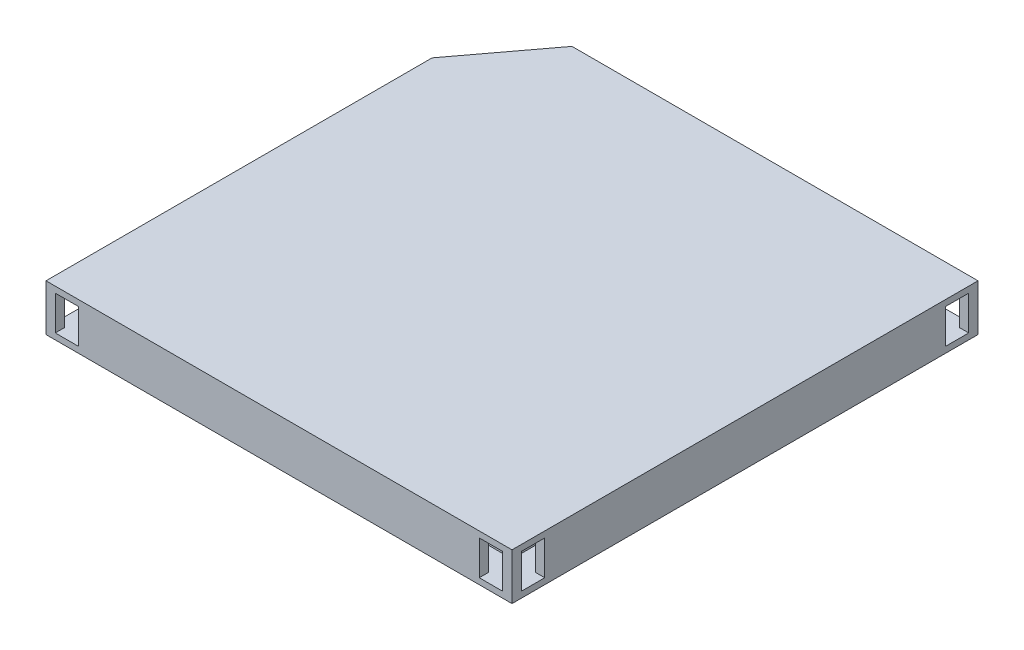
ISO-10303-21;
HEADER;
FILE_DESCRIPTION(('STEP AP214'),'2;1');
FILE_NAME('part.step','',(''),(''),'','','');
FILE_SCHEMA(('AUTOMOTIVE_DESIGN { 1 0 10303 214 1 1 1 1 }'));
ENDSEC;
DATA;
#1=APPLICATION_CONTEXT('core data for automotive mechanical design processes');
#2=APPLICATION_PROTOCOL_DEFINITION('international standard','automotive_design',2000,#1);
#3=PRODUCT_CONTEXT('',#1,'mechanical');
#4=PRODUCT('Part','Part','',(#3));
#5=PRODUCT_RELATED_PRODUCT_CATEGORY('part','',(#4));
#6=PRODUCT_DEFINITION_FORMATION('','',#4);
#7=PRODUCT_DEFINITION_CONTEXT('part definition',#1,'design');
#8=PRODUCT_DEFINITION('design','',#6,#7);
#9=PRODUCT_DEFINITION_SHAPE('','',#8);
#10=(LENGTH_UNIT() NAMED_UNIT(*) SI_UNIT(.MILLI.,.METRE.));
#11=(NAMED_UNIT(*) PLANE_ANGLE_UNIT() SI_UNIT($,.RADIAN.));
#12=(NAMED_UNIT(*) SI_UNIT($,.STERADIAN.) SOLID_ANGLE_UNIT());
#13=UNCERTAINTY_MEASURE_WITH_UNIT(LENGTH_MEASURE(1.E-05),#10,'distance_accuracy_value','');
#14=(GEOMETRIC_REPRESENTATION_CONTEXT(3) GLOBAL_UNCERTAINTY_ASSIGNED_CONTEXT((#13)) GLOBAL_UNIT_ASSIGNED_CONTEXT((#10,
#11,#12)) REPRESENTATION_CONTEXT('',''));
#15=CARTESIAN_POINT('',(0.,0.,0.));
#16=DIRECTION('',(0.,0.,1.));
#17=DIRECTION('',(1.,0.,0.));
#18=AXIS2_PLACEMENT_3D('',#15,#16,#17);
#19=CARTESIAN_POINT('',(-50.,-5.,50.));
#20=DIRECTION('',(1.,0.,0.));
#21=DIRECTION('',(0.,0.,-1.));
#22=AXIS2_PLACEMENT_3D('',#19,#20,#21);
#23=PLANE('',#22);
#24=DIRECTION('',(0.,1.,0.));
#25=VECTOR('',#24,1.);
#26=CARTESIAN_POINT('',(-50.0000000000001,-3.69974225331873,48.0105088504634));
#27=LINE('',#26,#25);
#28=CARTESIAN_POINT('',(-50.0000000000001,-3.69974225331873,48.0105088504634));
#29=VERTEX_POINT('',#28);
#30=CARTESIAN_POINT('',(-50.0000000000001,3.69974225331873,48.0105088504634));
#31=VERTEX_POINT('',#30);
#32=EDGE_CURVE('E307',#29,#31,#27,.T.);
#33=ORIENTED_EDGE('',*,*,#32,.F.);
#34=DIRECTION('',(0.,0.,1.));
#35=VECTOR('',#34,1.);
#36=CARTESIAN_POINT('',(-50.0000000000001,-3.69974225331873,42.9788398006332));
#37=LINE('',#36,#35);
#38=CARTESIAN_POINT('',(-50.,-3.69974225331873,42.9788398006332));
#39=VERTEX_POINT('',#38);
#40=EDGE_CURVE('E369',#39,#29,#37,.T.);
#41=ORIENTED_EDGE('',*,*,#40,.F.);
#42=DIRECTION('',(0.,-1.,0.));
#43=VECTOR('',#42,1.);
#44=CARTESIAN_POINT('',(-50.0000000000001,-3.69974225331873,42.9788398006332));
#45=LINE('',#44,#43);
#46=CARTESIAN_POINT('',(-50.0000000000001,3.69974225331873,42.9788398006332));
#47=VERTEX_POINT('',#46);
#48=EDGE_CURVE('E366',#47,#39,#45,.T.);
#49=ORIENTED_EDGE('',*,*,#48,.F.);
#50=DIRECTION('',(0.,0.,-1.));
#51=VECTOR('',#50,1.);
#52=CARTESIAN_POINT('',(-50.0000000000001,3.69974225331873,42.9788398006332));
#53=LINE('',#52,#51);
#54=EDGE_CURVE('E362',#31,#47,#53,.T.);
#55=ORIENTED_EDGE('',*,*,#54,.F.);
#56=EDGE_LOOP('',(#33,#41,#49,#55));
#57=FACE_BOUND('',#56,.T.);
#58=DIRECTION('',(0.,1.,0.));
#59=VECTOR('',#58,1.);
#60=CARTESIAN_POINT('',(-50.,-5.,-32.8587121027547));
#61=LINE('',#60,#59);
#62=CARTESIAN_POINT('',(-50.0000000000001,-5.,-32.8587121027547));
#63=VERTEX_POINT('',#62);
#64=CARTESIAN_POINT('',(-50.0000000000001,5.,-32.8587121027547));
#65=VERTEX_POINT('',#64);
#66=EDGE_CURVE('E254',#63,#65,#61,.T.);
#67=ORIENTED_EDGE('',*,*,#66,.F.);
#68=DIRECTION('',(0.,0.,-1.));
#69=VECTOR('',#68,1.);
#70=CARTESIAN_POINT('',(-50.,-5.,50.));
#71=LINE('',#70,#69);
#72=CARTESIAN_POINT('',(-50.,-5.,50.));
#73=VERTEX_POINT('',#72);
#74=EDGE_CURVE('E279',#73,#63,#71,.T.);
#75=ORIENTED_EDGE('',*,*,#74,.F.);
#76=DIRECTION('',(0.,-1.,0.));
#77=VECTOR('',#76,1.);
#78=CARTESIAN_POINT('',(-50.,-5.,50.));
#79=LINE('',#78,#77);
#80=CARTESIAN_POINT('',(-50.,5.,50.));
#81=VERTEX_POINT('',#80);
#82=EDGE_CURVE('E276',#81,#73,#79,.T.);
#83=ORIENTED_EDGE('',*,*,#82,.F.);
#84=DIRECTION('',(0.,0.,-1.));
#85=VECTOR('',#84,1.);
#86=CARTESIAN_POINT('',(-50.,5.,50.));
#87=LINE('',#86,#85);
#88=EDGE_CURVE('E269',#81,#65,#87,.T.);
#89=ORIENTED_EDGE('',*,*,#88,.T.);
#90=EDGE_LOOP('',(#67,#75,#83,#89));
#91=FACE_BOUND('',#90,.T.);
#92=ADVANCED_FACE('F39',(#57,#91),#23,.F.);
#93=CARTESIAN_POINT('',(-48.0105088504634,-3.69974225331873,50.0000000000001));
#94=DIRECTION('',(-1.,0.,0.));
#95=DIRECTION('',(0.,0.,1.));
#96=AXIS2_PLACEMENT_3D('',#93,#94,#95);
#97=PLANE('',#96);
#98=DIRECTION('',(0.,-1.,0.));
#99=VECTOR('',#98,1.);
#100=CARTESIAN_POINT('',(-48.0105088504634,-3.69974225331873,-35.5079834804539));
#101=LINE('',#100,#99);
#102=CARTESIAN_POINT('',(-48.0105088504634,3.69974225331873,-35.507983480454));
#103=VERTEX_POINT('',#102);
#104=CARTESIAN_POINT('',(-48.0105088504634,-3.69974225331873,-35.507983480454));
#105=VERTEX_POINT('',#104);
#106=EDGE_CURVE('E478',#103,#105,#101,.T.);
#107=ORIENTED_EDGE('',*,*,#106,.F.);
#108=DIRECTION('',(0.,0.,-1.));
#109=VECTOR('',#108,1.);
#110=CARTESIAN_POINT('',(-48.0105088504634,3.69974225331873,50.0000000000001));
#111=LINE('',#110,#109);
#112=CARTESIAN_POINT('',(-48.0105088504634,3.69974225331873,42.9788398006332));
#113=VERTEX_POINT('',#112);
#114=EDGE_CURVE('E401',#113,#103,#111,.T.);
#115=ORIENTED_EDGE('',*,*,#114,.F.);
#116=DIRECTION('',(0.,-1.,0.));
#117=VECTOR('',#116,1.);
#118=CARTESIAN_POINT('',(-48.0105088504634,-3.69974225331873,42.9788398006332));
#119=LINE('',#118,#117);
#120=CARTESIAN_POINT('',(-48.0105088504634,-3.69974225331873,42.9788398006332));
#121=VERTEX_POINT('',#120);
#122=EDGE_CURVE('E378',#113,#121,#119,.T.);
#123=ORIENTED_EDGE('',*,*,#122,.T.);
#124=DIRECTION('',(0.,0.,-1.));
#125=VECTOR('',#124,1.);
#126=CARTESIAN_POINT('',(-48.0105088504634,-3.69974225331873,50.0000000000001));
#127=LINE('',#126,#125);
#128=EDGE_CURVE('E410',#121,#105,#127,.T.);
#129=ORIENTED_EDGE('',*,*,#128,.T.);
#130=EDGE_LOOP('',(#107,#115,#123,#129));
#131=FACE_BOUND('',#130,.T.);
#132=ADVANCED_FACE('F521',(#131),#97,.F.);
#133=CARTESIAN_POINT('',(-42.9788398006332,-3.69974225331873,50.0000000000001));
#134=DIRECTION('',(1.,0.,0.));
#135=DIRECTION('',(0.,0.,-1.));
#136=AXIS2_PLACEMENT_3D('',#133,#134,#135);
#137=PLANE('',#136);
#138=DIRECTION('',(0.,1.,0.));
#139=VECTOR('',#138,1.);
#140=CARTESIAN_POINT('',(-42.9788398006332,-3.69974225331873,-42.2083182866052));
#141=LINE('',#140,#139);
#142=CARTESIAN_POINT('',(-42.9788398006332,-3.69974225331873,-42.2083182866052));
#143=VERTEX_POINT('',#142);
#144=CARTESIAN_POINT('',(-42.9788398006332,3.69974225331873,-42.2083182866052));
#145=VERTEX_POINT('',#144);
#146=EDGE_CURVE('E63',#143,#145,#141,.T.);
#147=ORIENTED_EDGE('',*,*,#146,.F.);
#148=DIRECTION('',(0.,0.,-1.));
#149=VECTOR('',#148,1.);
#150=CARTESIAN_POINT('',(-42.9788398006332,-3.69974225331873,50.0000000000001));
#151=LINE('',#150,#149);
#152=CARTESIAN_POINT('',(-42.9788398006332,-3.69974225331873,42.9788398006332));
#153=VERTEX_POINT('',#152);
#154=EDGE_CURVE('E405',#153,#143,#151,.T.);
#155=ORIENTED_EDGE('',*,*,#154,.F.);
#156=DIRECTION('',(0.,1.,0.));
#157=VECTOR('',#156,1.);
#158=CARTESIAN_POINT('',(-42.9788398006332,-3.69974225331873,42.9788398006332));
#159=LINE('',#158,#157);
#160=CARTESIAN_POINT('',(-42.9788398006332,3.69974225331873,42.9788398006332));
#161=VERTEX_POINT('',#160);
#162=EDGE_CURVE('E394',#153,#161,#159,.T.);
#163=ORIENTED_EDGE('',*,*,#162,.T.);
#164=DIRECTION('',(0.,0.,-1.));
#165=VECTOR('',#164,1.);
#166=CARTESIAN_POINT('',(-42.9788398006332,3.69974225331873,50.0000000000001));
#167=LINE('',#166,#165);
#168=EDGE_CURVE('E400',#161,#145,#167,.T.);
#169=ORIENTED_EDGE('',*,*,#168,.T.);
#170=EDGE_LOOP('',(#147,#155,#163,#169));
#171=FACE_BOUND('',#170,.T.);
#172=ADVANCED_FACE('F501',(#171),#137,.F.);
#173=CARTESIAN_POINT('',(-50.,5.,50.));
#174=DIRECTION('',(0.,-1.,0.));
#175=DIRECTION('',(0.,0.,-1.));
#176=AXIS2_PLACEMENT_3D('',#173,#174,#175);
#177=PLANE('',#176);
#178=DIRECTION('',(0.600490083349481,0.,-0.799632202827608));
#179=VECTOR('',#178,1.);
#180=CARTESIAN_POINT('',(-53.9443018978309,5.,-27.6063509020718));
#181=LINE('',#180,#179);
#182=CARTESIAN_POINT('',(-37.1276152189267,5.,-50.));
#183=VERTEX_POINT('',#182);
#184=EDGE_CURVE('E55',#65,#183,#181,.T.);
#185=ORIENTED_EDGE('',*,*,#184,.F.);
#186=ORIENTED_EDGE('',*,*,#88,.F.);
#187=DIRECTION('',(-1.,0.,0.));
#188=VECTOR('',#187,1.);
#189=CARTESIAN_POINT('',(-50.,5.,50.));
#190=LINE('',#189,#188);
#191=CARTESIAN_POINT('',(50.,5.,50.));
#192=VERTEX_POINT('',#191);
#193=EDGE_CURVE('E636',#192,#81,#190,.T.);
#194=ORIENTED_EDGE('',*,*,#193,.F.);
#195=DIRECTION('',(0.,0.,-1.));
#196=VECTOR('',#195,1.);
#197=CARTESIAN_POINT('',(50.,5.,50.));
#198=LINE('',#197,#196);
#199=CARTESIAN_POINT('',(50.,5.,-50.));
#200=VERTEX_POINT('',#199);
#201=EDGE_CURVE('E278',#192,#200,#198,.T.);
#202=ORIENTED_EDGE('',*,*,#201,.T.);
#203=DIRECTION('',(-1.,0.,0.));
#204=VECTOR('',#203,1.);
#205=CARTESIAN_POINT('',(-50.,5.,-50.));
#206=LINE('',#205,#204);
#207=EDGE_CURVE('E272',#200,#183,#206,.T.);
#208=ORIENTED_EDGE('',*,*,#207,.T.);
#209=EDGE_LOOP('',(#185,#186,#194,#202,#208));
#210=FACE_BOUND('',#209,.T.);
#211=ADVANCED_FACE('F268',(#210),#177,.F.);
#212=CARTESIAN_POINT('',(-50.,-5.,50.));
#213=DIRECTION('',(0.,1.,0.));
#214=DIRECTION('',(0.,0.,1.));
#215=AXIS2_PLACEMENT_3D('',#212,#213,#214);
#216=PLANE('',#215);
#217=DIRECTION('',(-0.600490083349481,0.,0.799632202827608));
#218=VECTOR('',#217,1.);
#219=CARTESIAN_POINT('',(-89.7863678940514,-5.,20.1221145316696));
#220=LINE('',#219,#218);
#221=CARTESIAN_POINT('',(-37.1276152189267,-5.,-50.));
#222=VERTEX_POINT('',#221);
#223=EDGE_CURVE('E257',#222,#63,#220,.T.);
#224=ORIENTED_EDGE('',*,*,#223,.F.);
#225=DIRECTION('',(1.,0.,0.));
#226=VECTOR('',#225,1.);
#227=CARTESIAN_POINT('',(-50.,-5.,-50.));
#228=LINE('',#227,#226);
#229=CARTESIAN_POINT('',(50.,-5.,-50.));
#230=VERTEX_POINT('',#229);
#231=EDGE_CURVE('E620',#222,#230,#228,.T.);
#232=ORIENTED_EDGE('',*,*,#231,.T.);
#233=DIRECTION('',(0.,0.,-1.));
#234=VECTOR('',#233,1.);
#235=CARTESIAN_POINT('',(50.,-5.,50.));
#236=LINE('',#235,#234);
#237=CARTESIAN_POINT('',(50.,-5.,50.));
#238=VERTEX_POINT('',#237);
#239=EDGE_CURVE('E285',#238,#230,#236,.T.);
#240=ORIENTED_EDGE('',*,*,#239,.F.);
#241=DIRECTION('',(1.,0.,0.));
#242=VECTOR('',#241,1.);
#243=CARTESIAN_POINT('',(-50.,-5.,50.));
#244=LINE('',#243,#242);
#245=EDGE_CURVE('E623',#73,#238,#244,.T.);
#246=ORIENTED_EDGE('',*,*,#245,.F.);
#247=ORIENTED_EDGE('',*,*,#74,.T.);
#248=EDGE_LOOP('',(#224,#232,#240,#246,#247));
#249=FACE_BOUND('',#248,.T.);
#250=ADVANCED_FACE('F534',(#249),#216,.F.);
#251=CARTESIAN_POINT('',(0.,0.,-50.));
#252=DIRECTION('',(0.,0.,-1.));
#253=DIRECTION('',(-1.,0.,0.));
#254=AXIS2_PLACEMENT_3D('',#251,#252,#253);
#255=PLANE('',#254);
#256=DIRECTION('',(0.,1.,0.));
#257=VECTOR('',#256,1.);
#258=CARTESIAN_POINT('',(48.0105088504634,-3.69974225331873,-50.));
#259=LINE('',#258,#257);
#260=CARTESIAN_POINT('',(48.0105088504634,-3.69974225331873,-50.));
#261=VERTEX_POINT('',#260);
#262=CARTESIAN_POINT('',(48.0105088504634,3.69974225331873,-50.));
#263=VERTEX_POINT('',#262);
#264=EDGE_CURVE('E676',#261,#263,#259,.T.);
#265=ORIENTED_EDGE('',*,*,#264,.T.);
#266=DIRECTION('',(-1.,0.,0.));
#267=VECTOR('',#266,1.);
#268=CARTESIAN_POINT('',(42.9788398006332,3.69974225331873,-50.));
#269=LINE('',#268,#267);
#270=CARTESIAN_POINT('',(42.9788398006332,3.69974225331873,-50.));
#271=VERTEX_POINT('',#270);
#272=EDGE_CURVE('E663',#263,#271,#269,.T.);
#273=ORIENTED_EDGE('',*,*,#272,.T.);
#274=DIRECTION('',(0.,-1.,0.));
#275=VECTOR('',#274,1.);
#276=CARTESIAN_POINT('',(42.9788398006332,-3.69974225331873,-50.));
#277=LINE('',#276,#275);
#278=CARTESIAN_POINT('',(42.9788398006332,-3.69974225331873,-50.));
#279=VERTEX_POINT('',#278);
#280=EDGE_CURVE('E657',#271,#279,#277,.T.);
#281=ORIENTED_EDGE('',*,*,#280,.T.);
#282=DIRECTION('',(1.,0.,0.));
#283=VECTOR('',#282,1.);
#284=CARTESIAN_POINT('',(42.9788398006332,-3.69974225331873,-50.));
#285=LINE('',#284,#283);
#286=EDGE_CURVE('E652',#279,#261,#285,.T.);
#287=ORIENTED_EDGE('',*,*,#286,.T.);
#288=EDGE_LOOP('',(#265,#273,#281,#287));
#289=FACE_BOUND('',#288,.T.);
#290=ORIENTED_EDGE('',*,*,#231,.F.);
#291=DIRECTION('',(0.,1.,0.));
#292=VECTOR('',#291,1.);
#293=CARTESIAN_POINT('',(-37.1276152189267,0.,-50.));
#294=LINE('',#293,#292);
#295=EDGE_CURVE('E474',#222,#183,#294,.T.);
#296=ORIENTED_EDGE('',*,*,#295,.T.);
#297=ORIENTED_EDGE('',*,*,#207,.F.);
#298=DIRECTION('',(0.,1.,0.));
#299=VECTOR('',#298,1.);
#300=CARTESIAN_POINT('',(50.,-5.,-50.));
#301=LINE('',#300,#299);
#302=EDGE_CURVE('E608',#230,#200,#301,.T.);
#303=ORIENTED_EDGE('',*,*,#302,.F.);
#304=EDGE_LOOP('',(#290,#296,#297,#303));
#305=FACE_BOUND('',#304,.T.);
#306=ADVANCED_FACE('F541',(#289,#305),#255,.T.);
#307=CARTESIAN_POINT('',(42.9788398006332,-3.69974225331873,-50.));
#308=DIRECTION('',(0.,-1.,0.));
#309=DIRECTION('',(0.,0.,-1.));
#310=AXIS2_PLACEMENT_3D('',#307,#308,#309);
#311=PLANE('',#310);
#312=DIRECTION('',(0.600490083349481,0.,-0.799632202827608));
#313=VECTOR('',#312,1.);
#314=CARTESIAN_POINT('',(-8.24216156403217,-3.69974225331873,-88.4648132853434));
#315=LINE('',#314,#313);
#316=EDGE_CURVE('E477',#105,#143,#315,.T.);
#317=ORIENTED_EDGE('',*,*,#316,.F.);
#318=ORIENTED_EDGE('',*,*,#128,.F.);
#319=DIRECTION('',(1.,0.,0.));
#320=VECTOR('',#319,1.);
#321=CARTESIAN_POINT('',(-50.0000000000001,-3.69974225331873,42.9788398006332));
#322=LINE('',#321,#320);
#323=EDGE_CURVE('E336',#39,#121,#322,.T.);
#324=ORIENTED_EDGE('',*,*,#323,.F.);
#325=ORIENTED_EDGE('',*,*,#40,.T.);
#326=DIRECTION('',(1.,0.,0.));
#327=VECTOR('',#326,1.);
#328=CARTESIAN_POINT('',(-50.0000000000001,-3.69974225331873,48.0105088504634));
#329=LINE('',#328,#327);
#330=CARTESIAN_POINT('',(-48.0105088504634,-3.69974225331873,48.0105088504634));
#331=VERTEX_POINT('',#330);
#332=EDGE_CURVE('E350',#29,#331,#329,.T.);
#333=ORIENTED_EDGE('',*,*,#332,.T.);
#334=CARTESIAN_POINT('',(-48.0105088504634,-3.69974225331873,50.0000000000001));
#335=VERTEX_POINT('',#334);
#336=EDGE_CURVE('E299',#335,#331,#127,.T.);
#337=ORIENTED_EDGE('',*,*,#336,.F.);
#338=DIRECTION('',(-1.,0.,0.));
#339=VECTOR('',#338,1.);
#340=CARTESIAN_POINT('',(-42.9788398006332,-3.69974225331873,50.0000000000001));
#341=LINE('',#340,#339);
#342=CARTESIAN_POINT('',(-42.9788398006332,-3.69974225331873,50.0000000000001));
#343=VERTEX_POINT('',#342);
#344=EDGE_CURVE('E413',#343,#335,#341,.T.);
#345=ORIENTED_EDGE('',*,*,#344,.F.);
#346=CARTESIAN_POINT('',(-42.9788398006332,-3.69974225331873,48.0105088504634));
#347=VERTEX_POINT('',#346);
#348=EDGE_CURVE('E406',#343,#347,#151,.T.);
#349=ORIENTED_EDGE('',*,*,#348,.T.);
#350=CARTESIAN_POINT('',(42.9788398006332,-3.69974225331873,48.0105088504634));
#351=VERTEX_POINT('',#350);
#352=EDGE_CURVE('E356',#347,#351,#329,.T.);
#353=ORIENTED_EDGE('',*,*,#352,.T.);
#354=DIRECTION('',(0.,0.,1.));
#355=VECTOR('',#354,1.);
#356=CARTESIAN_POINT('',(42.9788398006332,-3.69974225331873,-50.));
#357=LINE('',#356,#355);
#358=CARTESIAN_POINT('',(42.9788398006332,-3.69974225331873,50.));
#359=VERTEX_POINT('',#358);
#360=EDGE_CURVE('E576',#351,#359,#357,.T.);
#361=ORIENTED_EDGE('',*,*,#360,.T.);
#362=DIRECTION('',(1.,0.,0.));
#363=VECTOR('',#362,1.);
#364=CARTESIAN_POINT('',(42.9788398006332,-3.69974225331873,50.));
#365=LINE('',#364,#363);
#366=CARTESIAN_POINT('',(48.0105088504634,-3.69974225331873,50.));
#367=VERTEX_POINT('',#366);
#368=EDGE_CURVE('E674',#359,#367,#365,.T.);
#369=ORIENTED_EDGE('',*,*,#368,.T.);
#370=DIRECTION('',(0.,0.,1.));
#371=VECTOR('',#370,1.);
#372=CARTESIAN_POINT('',(48.0105088504634,-3.69974225331873,-50.));
#373=LINE('',#372,#371);
#374=CARTESIAN_POINT('',(48.0105088504634,-3.69974225331873,48.0105088504634));
#375=VERTEX_POINT('',#374);
#376=EDGE_CURVE('E596',#375,#367,#373,.T.);
#377=ORIENTED_EDGE('',*,*,#376,.F.);
#378=CARTESIAN_POINT('',(50.,-3.69974225331873,48.0105088504634));
#379=VERTEX_POINT('',#378);
#380=EDGE_CURVE('E357',#375,#379,#329,.T.);
#381=ORIENTED_EDGE('',*,*,#380,.T.);
#382=DIRECTION('',(0.,0.,1.));
#383=VECTOR('',#382,1.);
#384=CARTESIAN_POINT('',(50.,-3.69974225331873,42.9788398006332));
#385=LINE('',#384,#383);
#386=CARTESIAN_POINT('',(50.,-3.69974225331873,42.9788398006332));
#387=VERTEX_POINT('',#386);
#388=EDGE_CURVE('E377',#387,#379,#385,.T.);
#389=ORIENTED_EDGE('',*,*,#388,.F.);
#390=CARTESIAN_POINT('',(48.0105088504634,-3.69974225331873,42.9788398006332));
#391=VERTEX_POINT('',#390);
#392=EDGE_CURVE('E342',#391,#387,#322,.T.);
#393=ORIENTED_EDGE('',*,*,#392,.F.);
#394=CARTESIAN_POINT('',(48.0105088504634,-3.69974225331873,-42.9788398006332));
#395=VERTEX_POINT('',#394);
#396=EDGE_CURVE('E599',#395,#391,#373,.T.);
#397=ORIENTED_EDGE('',*,*,#396,.F.);
#398=DIRECTION('',(-1.,0.,0.));
#399=VECTOR('',#398,1.);
#400=CARTESIAN_POINT('',(50.,-3.69974225331873,-42.9788398006332));
#401=LINE('',#400,#399);
#402=CARTESIAN_POINT('',(50.,-3.69974225331873,-42.9788398006332));
#403=VERTEX_POINT('',#402);
#404=EDGE_CURVE('E449',#403,#395,#401,.T.);
#405=ORIENTED_EDGE('',*,*,#404,.F.);
#406=DIRECTION('',(0.,0.,-1.));
#407=VECTOR('',#406,1.);
#408=CARTESIAN_POINT('',(50.,-3.69974225331873,-42.9788398006332));
#409=LINE('',#408,#407);
#410=CARTESIAN_POINT('',(50.,-3.69974225331873,-48.0105088504634));
#411=VERTEX_POINT('',#410);
#412=EDGE_CURVE('E467',#403,#411,#409,.T.);
#413=ORIENTED_EDGE('',*,*,#412,.T.);
#414=DIRECTION('',(-1.,0.,0.));
#415=VECTOR('',#414,1.);
#416=CARTESIAN_POINT('',(50.,-3.69974225331873,-48.0105088504634));
#417=LINE('',#416,#415);
#418=CARTESIAN_POINT('',(48.0105088504634,-3.69974225331873,-48.0105088504634));
#419=VERTEX_POINT('',#418);
#420=EDGE_CURVE('E444',#411,#419,#417,.T.);
#421=ORIENTED_EDGE('',*,*,#420,.T.);
#422=EDGE_CURVE('E600',#261,#419,#373,.T.);
#423=ORIENTED_EDGE('',*,*,#422,.F.);
#424=ORIENTED_EDGE('',*,*,#286,.F.);
#425=CARTESIAN_POINT('',(42.9788398006332,-3.69974225331873,-48.0105088504634));
#426=VERTEX_POINT('',#425);
#427=EDGE_CURVE('E586',#279,#426,#357,.T.);
#428=ORIENTED_EDGE('',*,*,#427,.T.);
#429=CARTESIAN_POINT('',(-38.6216392239427,-3.69974225331873,-48.0105088504634));
#430=VERTEX_POINT('',#429);
#431=EDGE_CURVE('E448',#426,#430,#417,.T.);
#432=ORIENTED_EDGE('',*,*,#431,.T.);
#433=CARTESIAN_POINT('',(-42.400210617685,-3.69974225331873,-42.9788398006332));
#434=VERTEX_POINT('',#433);
#435=EDGE_CURVE('E489',#434,#430,#315,.T.);
#436=ORIENTED_EDGE('',*,*,#435,.F.);
#437=CARTESIAN_POINT('',(42.9788398006332,-3.69974225331873,-42.9788398006332));
#438=VERTEX_POINT('',#437);
#439=EDGE_CURVE('E447',#438,#434,#401,.T.);
#440=ORIENTED_EDGE('',*,*,#439,.F.);
#441=CARTESIAN_POINT('',(42.9788398006332,-3.69974225331873,42.9788398006332));
#442=VERTEX_POINT('',#441);
#443=EDGE_CURVE('E583',#438,#442,#357,.T.);
#444=ORIENTED_EDGE('',*,*,#443,.T.);
#445=EDGE_CURVE('E341',#153,#442,#322,.T.);
#446=ORIENTED_EDGE('',*,*,#445,.F.);
#447=ORIENTED_EDGE('',*,*,#154,.T.);
#448=EDGE_LOOP('',(#317,#318,#324,#325,#333,#337,#345,#349,#353,#361,#369,#377,#381,#389,#393,
#397,#405,#413,#421,#423,#424,#428,#432,#436,#440,#444,#446,#447));
#449=FACE_BOUND('',#448,.T.);
#450=ADVANCED_FACE('F518',(#449),#311,.F.);
#451=CARTESIAN_POINT('',(42.9788398006332,3.69974225331873,-50.));
#452=DIRECTION('',(0.,1.,0.));
#453=DIRECTION('',(0.,0.,1.));
#454=AXIS2_PLACEMENT_3D('',#451,#452,#453);
#455=PLANE('',#454);
#456=DIRECTION('',(-0.600490083349481,0.,0.799632202827608));
#457=VECTOR('',#456,1.);
#458=CARTESIAN_POINT('',(-8.24216156403217,3.69974225331873,-88.4648132853434));
#459=LINE('',#458,#457);
#460=CARTESIAN_POINT('',(-38.6216392239427,3.69974225331874,-48.0105088504634));
#461=VERTEX_POINT('',#460);
#462=CARTESIAN_POINT('',(-42.400210617685,3.69974225331873,-42.9788398006332));
#463=VERTEX_POINT('',#462);
#464=EDGE_CURVE('E274',#461,#463,#459,.T.);
#465=ORIENTED_EDGE('',*,*,#464,.F.);
#466=DIRECTION('',(-1.,0.,0.));
#467=VECTOR('',#466,1.);
#468=CARTESIAN_POINT('',(50.,3.69974225331873,-48.0105088504634));
#469=LINE('',#468,#467);
#470=CARTESIAN_POINT('',(42.9788398006332,3.69974225331873,-48.0105088504634));
#471=VERTEX_POINT('',#470);
#472=EDGE_CURVE('E457',#471,#461,#469,.T.);
#473=ORIENTED_EDGE('',*,*,#472,.F.);
#474=DIRECTION('',(0.,0.,1.));
#475=VECTOR('',#474,1.);
#476=CARTESIAN_POINT('',(42.9788398006332,3.69974225331873,-50.));
#477=LINE('',#476,#475);
#478=EDGE_CURVE('E584',#271,#471,#477,.T.);
#479=ORIENTED_EDGE('',*,*,#478,.F.);
#480=ORIENTED_EDGE('',*,*,#272,.F.);
#481=DIRECTION('',(0.,0.,1.));
#482=VECTOR('',#481,1.);
#483=CARTESIAN_POINT('',(48.0105088504634,3.69974225331873,-50.));
#484=LINE('',#483,#482);
#485=CARTESIAN_POINT('',(48.0105088504634,3.69974225331873,-48.0105088504634));
#486=VERTEX_POINT('',#485);
#487=EDGE_CURVE('E642',#263,#486,#484,.T.);
#488=ORIENTED_EDGE('',*,*,#487,.T.);
#489=CARTESIAN_POINT('',(50.,3.69974225331873,-48.0105088504634));
#490=VERTEX_POINT('',#489);
#491=EDGE_CURVE('E443',#490,#486,#469,.T.);
#492=ORIENTED_EDGE('',*,*,#491,.F.);
#493=DIRECTION('',(0.,0.,1.));
#494=VECTOR('',#493,1.);
#495=CARTESIAN_POINT('',(50.,3.69974225331873,-42.9788398006332));
#496=LINE('',#495,#494);
#497=CARTESIAN_POINT('',(50.,3.69974225331873,-42.9788398006332));
#498=VERTEX_POINT('',#497);
#499=EDGE_CURVE('E460',#490,#498,#496,.T.);
#500=ORIENTED_EDGE('',*,*,#499,.T.);
#501=DIRECTION('',(-1.,0.,0.));
#502=VECTOR('',#501,1.);
#503=CARTESIAN_POINT('',(50.,3.69974225331873,-42.9788398006332));
#504=LINE('',#503,#502);
#505=CARTESIAN_POINT('',(48.0105088504634,3.69974225331873,-42.9788398006332));
#506=VERTEX_POINT('',#505);
#507=EDGE_CURVE('E453',#498,#506,#504,.T.);
#508=ORIENTED_EDGE('',*,*,#507,.T.);
#509=CARTESIAN_POINT('',(48.0105088504634,3.69974225331873,42.9788398006332));
#510=VERTEX_POINT('',#509);
#511=EDGE_CURVE('E645',#506,#510,#484,.T.);
#512=ORIENTED_EDGE('',*,*,#511,.T.);
#513=DIRECTION('',(1.,0.,0.));
#514=VECTOR('',#513,1.);
#515=CARTESIAN_POINT('',(-50.0000000000001,3.69974225331873,42.9788398006332));
#516=LINE('',#515,#514);
#517=CARTESIAN_POINT('',(50.,3.69974225331873,42.9788398006332));
#518=VERTEX_POINT('',#517);
#519=EDGE_CURVE('E330',#510,#518,#516,.T.);
#520=ORIENTED_EDGE('',*,*,#519,.T.);
#521=DIRECTION('',(0.,0.,-1.));
#522=VECTOR('',#521,1.);
#523=CARTESIAN_POINT('',(50.,3.69974225331873,42.9788398006332));
#524=LINE('',#523,#522);
#525=CARTESIAN_POINT('',(50.,3.69974225331873,48.0105088504634));
#526=VERTEX_POINT('',#525);
#527=EDGE_CURVE('E384',#526,#518,#524,.T.);
#528=ORIENTED_EDGE('',*,*,#527,.F.);
#529=DIRECTION('',(1.,0.,0.));
#530=VECTOR('',#529,1.);
#531=CARTESIAN_POINT('',(-50.0000000000001,3.69974225331873,48.0105088504634));
#532=LINE('',#531,#530);
#533=CARTESIAN_POINT('',(48.0105088504634,3.69974225331873,48.0105088504634));
#534=VERTEX_POINT('',#533);
#535=EDGE_CURVE('E314',#534,#526,#532,.T.);
#536=ORIENTED_EDGE('',*,*,#535,.F.);
#537=CARTESIAN_POINT('',(48.0105088504634,3.69974225331873,50.));
#538=VERTEX_POINT('',#537);
#539=EDGE_CURVE('E646',#534,#538,#484,.T.);
#540=ORIENTED_EDGE('',*,*,#539,.T.);
#541=DIRECTION('',(-1.,0.,0.));
#542=VECTOR('',#541,1.);
#543=CARTESIAN_POINT('',(42.9788398006332,3.69974225331873,50.));
#544=LINE('',#543,#542);
#545=CARTESIAN_POINT('',(42.9788398006332,3.69974225331873,50.));
#546=VERTEX_POINT('',#545);
#547=EDGE_CURVE('E670',#538,#546,#544,.T.);
#548=ORIENTED_EDGE('',*,*,#547,.T.);
#549=CARTESIAN_POINT('',(42.9788398006332,3.69974225331873,48.0105088504634));
#550=VERTEX_POINT('',#549);
#551=EDGE_CURVE('E592',#550,#546,#477,.T.);
#552=ORIENTED_EDGE('',*,*,#551,.F.);
#553=CARTESIAN_POINT('',(-42.9788398006332,3.69974225331873,48.0105088504634));
#554=VERTEX_POINT('',#553);
#555=EDGE_CURVE('E312',#554,#550,#532,.T.);
#556=ORIENTED_EDGE('',*,*,#555,.F.);
#557=CARTESIAN_POINT('',(-42.9788398006332,3.69974225331873,50.));
#558=VERTEX_POINT('',#557);
#559=EDGE_CURVE('E402',#558,#554,#167,.T.);
#560=ORIENTED_EDGE('',*,*,#559,.F.);
#561=DIRECTION('',(1.,0.,0.));
#562=VECTOR('',#561,1.);
#563=CARTESIAN_POINT('',(-42.9788398006332,3.69974225331873,50.0000000000001));
#564=LINE('',#563,#562);
#565=CARTESIAN_POINT('',(-48.0105088504634,3.69974225331873,50.0000000000001));
#566=VERTEX_POINT('',#565);
#567=EDGE_CURVE('E421',#566,#558,#564,.T.);
#568=ORIENTED_EDGE('',*,*,#567,.F.);
#569=CARTESIAN_POINT('',(-48.0105088504634,3.69974225331873,48.0105088504634));
#570=VERTEX_POINT('',#569);
#571=EDGE_CURVE('E297',#566,#570,#111,.T.);
#572=ORIENTED_EDGE('',*,*,#571,.T.);
#573=EDGE_CURVE('E304',#31,#570,#532,.T.);
#574=ORIENTED_EDGE('',*,*,#573,.F.);
#575=ORIENTED_EDGE('',*,*,#54,.T.);
#576=EDGE_CURVE('E323',#47,#113,#516,.T.);
#577=ORIENTED_EDGE('',*,*,#576,.T.);
#578=ORIENTED_EDGE('',*,*,#114,.T.);
#579=EDGE_CURVE('E484',#145,#103,#459,.T.);
#580=ORIENTED_EDGE('',*,*,#579,.F.);
#581=ORIENTED_EDGE('',*,*,#168,.F.);
#582=CARTESIAN_POINT('',(42.9788398006332,3.69974225331873,42.9788398006332));
#583=VERTEX_POINT('',#582);
#584=EDGE_CURVE('E329',#161,#583,#516,.T.);
#585=ORIENTED_EDGE('',*,*,#584,.T.);
#586=CARTESIAN_POINT('',(42.9788398006332,3.69974225331873,-42.9788398006332));
#587=VERTEX_POINT('',#586);
#588=EDGE_CURVE('E590',#587,#583,#477,.T.);
#589=ORIENTED_EDGE('',*,*,#588,.F.);
#590=EDGE_CURVE('E452',#587,#463,#504,.T.);
#591=ORIENTED_EDGE('',*,*,#590,.T.);
#592=EDGE_LOOP('',(#465,#473,#479,#480,#488,#492,#500,#508,#512,#520,#528,#536,#540,#548,#552,
#556,#560,#568,#572,#574,#575,#577,#578,#580,#581,#585,#589,#591));
#593=FACE_BOUND('',#592,.T.);
#594=ADVANCED_FACE('F500',(#593),#455,.F.);
#595=CARTESIAN_POINT('',(50.,-3.69974225331873,-42.9788398006332));
#596=DIRECTION('',(0.,0.,-1.));
#597=DIRECTION('',(-1.,0.,0.));
#598=AXIS2_PLACEMENT_3D('',#595,#596,#597);
#599=PLANE('',#598);
#600=ORIENTED_EDGE('',*,*,#439,.T.);
#601=DIRECTION('',(0.,1.,0.));
#602=VECTOR('',#601,1.);
#603=CARTESIAN_POINT('',(-42.400210617685,-3.69974225331873,-42.9788398006332));
#604=LINE('',#603,#602);
#605=EDGE_CURVE('E485',#434,#463,#604,.T.);
#606=ORIENTED_EDGE('',*,*,#605,.T.);
#607=ORIENTED_EDGE('',*,*,#590,.F.);
#608=DIRECTION('',(0.,-1.,0.));
#609=VECTOR('',#608,1.);
#610=CARTESIAN_POINT('',(42.9788398006332,-3.69974225331873,-42.9788398006332));
#611=LINE('',#610,#609);
#612=EDGE_CURVE('E439',#587,#438,#611,.T.);
#613=ORIENTED_EDGE('',*,*,#612,.T.);
#614=EDGE_LOOP('',(#600,#606,#607,#613));
#615=FACE_BOUND('',#614,.T.);
#616=ADVANCED_FACE('F715',(#615),#599,.T.);
#617=CARTESIAN_POINT('',(50.,-3.69974225331873,-48.0105088504634));
#618=DIRECTION('',(0.,0.,1.));
#619=DIRECTION('',(1.,0.,0.));
#620=AXIS2_PLACEMENT_3D('',#617,#618,#619);
#621=PLANE('',#620);
#622=ORIENTED_EDGE('',*,*,#472,.T.);
#623=DIRECTION('',(0.,-1.,0.));
#624=VECTOR('',#623,1.);
#625=CARTESIAN_POINT('',(-38.6216392239427,-3.69974225331873,-48.0105088504634));
#626=LINE('',#625,#624);
#627=EDGE_CURVE('E11',#461,#430,#626,.T.);
#628=ORIENTED_EDGE('',*,*,#627,.T.);
#629=ORIENTED_EDGE('',*,*,#431,.F.);
#630=DIRECTION('',(0.,1.,0.));
#631=VECTOR('',#630,1.);
#632=CARTESIAN_POINT('',(42.9788398006332,-3.69974225331873,-48.0105088504634));
#633=LINE('',#632,#631);
#634=EDGE_CURVE('E433',#426,#471,#633,.T.);
#635=ORIENTED_EDGE('',*,*,#634,.T.);
#636=EDGE_LOOP('',(#622,#628,#629,#635));
#637=FACE_BOUND('',#636,.T.);
#638=ADVANCED_FACE('F694',(#637),#621,.T.);
#639=CARTESIAN_POINT('',(50.,-5.,50.));
#640=DIRECTION('',(-1.,0.,0.));
#641=DIRECTION('',(0.,0.,1.));
#642=AXIS2_PLACEMENT_3D('',#639,#640,#641);
#643=PLANE('',#642);
#644=DIRECTION('',(0.,1.,0.));
#645=VECTOR('',#644,1.);
#646=CARTESIAN_POINT('',(50.,-3.69974225331873,48.0105088504634));
#647=LINE('',#646,#645);
#648=EDGE_CURVE('E373',#379,#526,#647,.T.);
#649=ORIENTED_EDGE('',*,*,#648,.T.);
#650=ORIENTED_EDGE('',*,*,#527,.T.);
#651=DIRECTION('',(0.,-1.,0.));
#652=VECTOR('',#651,1.);
#653=CARTESIAN_POINT('',(50.,-3.69974225331873,42.9788398006332));
#654=LINE('',#653,#652);
#655=EDGE_CURVE('E381',#518,#387,#654,.T.);
#656=ORIENTED_EDGE('',*,*,#655,.T.);
#657=ORIENTED_EDGE('',*,*,#388,.T.);
#658=EDGE_LOOP('',(#649,#650,#656,#657));
#659=FACE_BOUND('',#658,.T.);
#660=ORIENTED_EDGE('',*,*,#302,.T.);
#661=ORIENTED_EDGE('',*,*,#201,.F.);
#662=DIRECTION('',(0.,1.,0.));
#663=VECTOR('',#662,1.);
#664=CARTESIAN_POINT('',(50.,-5.,50.));
#665=LINE('',#664,#663);
#666=EDGE_CURVE('E627',#238,#192,#665,.T.);
#667=ORIENTED_EDGE('',*,*,#666,.F.);
#668=ORIENTED_EDGE('',*,*,#239,.T.);
#669=EDGE_LOOP('',(#660,#661,#667,#668));
#670=FACE_BOUND('',#669,.T.);
#671=DIRECTION('',(0.,1.,0.));
#672=VECTOR('',#671,1.);
#673=CARTESIAN_POINT('',(50.,-3.69974225331873,-48.0105088504634));
#674=LINE('',#673,#672);
#675=EDGE_CURVE('E263',#411,#490,#674,.T.);
#676=ORIENTED_EDGE('',*,*,#675,.F.);
#677=ORIENTED_EDGE('',*,*,#412,.F.);
#678=DIRECTION('',(0.,-1.,0.));
#679=VECTOR('',#678,1.);
#680=CARTESIAN_POINT('',(50.,-3.69974225331873,-42.9788398006332));
#681=LINE('',#680,#679);
#682=EDGE_CURVE('E463',#498,#403,#681,.T.);
#683=ORIENTED_EDGE('',*,*,#682,.F.);
#684=ORIENTED_EDGE('',*,*,#499,.F.);
#685=EDGE_LOOP('',(#676,#677,#683,#684));
#686=FACE_BOUND('',#685,.T.);
#687=ADVANCED_FACE('F41',(#659,#670,#686),#643,.F.);
#688=CARTESIAN_POINT('',(48.0105088504634,-3.69974225331873,-50.));
#689=DIRECTION('',(1.,0.,0.));
#690=DIRECTION('',(0.,0.,-1.));
#691=AXIS2_PLACEMENT_3D('',#688,#689,#690);
#692=PLANE('',#691);
#693=DIRECTION('',(0.,-1.,0.));
#694=VECTOR('',#693,1.);
#695=CARTESIAN_POINT('',(48.0105088504634,-3.69974225331873,-48.0105088504634));
#696=LINE('',#695,#694);
#697=EDGE_CURVE('E429',#486,#419,#696,.T.);
#698=ORIENTED_EDGE('',*,*,#697,.F.);
#699=ORIENTED_EDGE('',*,*,#487,.F.);
#700=ORIENTED_EDGE('',*,*,#264,.F.);
#701=ORIENTED_EDGE('',*,*,#422,.T.);
#702=EDGE_LOOP('',(#698,#699,#700,#701));
#703=FACE_BOUND('',#702,.T.);
#704=ADVANCED_FACE('F693',(#703),#692,.F.);
#705=DIRECTION('',(0.,1.,0.));
#706=VECTOR('',#705,1.);
#707=CARTESIAN_POINT('',(48.0105088504634,-3.69974225331873,-42.9788398006332));
#708=LINE('',#707,#706);
#709=EDGE_CURVE('E436',#395,#506,#708,.T.);
#710=ORIENTED_EDGE('',*,*,#709,.F.);
#711=ORIENTED_EDGE('',*,*,#396,.T.);
#712=DIRECTION('',(0.,-1.,0.));
#713=VECTOR('',#712,1.);
#714=CARTESIAN_POINT('',(48.0105088504634,-3.69974225331873,42.9788398006332));
#715=LINE('',#714,#713);
#716=EDGE_CURVE('E318',#510,#391,#715,.T.);
#717=ORIENTED_EDGE('',*,*,#716,.F.);
#718=ORIENTED_EDGE('',*,*,#511,.F.);
#719=EDGE_LOOP('',(#710,#711,#717,#718));
#720=FACE_BOUND('',#719,.T.);
#721=ADVANCED_FACE('F690',(#720),#692,.F.);
#722=CARTESIAN_POINT('',(42.9788398006332,-3.69974225331873,-50.));
#723=DIRECTION('',(-1.,0.,0.));
#724=DIRECTION('',(0.,0.,1.));
#725=AXIS2_PLACEMENT_3D('',#722,#723,#724);
#726=PLANE('',#725);
#727=ORIENTED_EDGE('',*,*,#634,.F.);
#728=ORIENTED_EDGE('',*,*,#427,.F.);
#729=ORIENTED_EDGE('',*,*,#280,.F.);
#730=ORIENTED_EDGE('',*,*,#478,.T.);
#731=EDGE_LOOP('',(#727,#728,#729,#730));
#732=FACE_BOUND('',#731,.T.);
#733=ADVANCED_FACE('F710',(#732),#726,.F.);
#734=ORIENTED_EDGE('',*,*,#612,.F.);
#735=ORIENTED_EDGE('',*,*,#588,.T.);
#736=DIRECTION('',(0.,1.,0.));
#737=VECTOR('',#736,1.);
#738=CARTESIAN_POINT('',(42.9788398006332,-3.69974225331873,42.9788398006332));
#739=LINE('',#738,#737);
#740=EDGE_CURVE('E311',#442,#583,#739,.T.);
#741=ORIENTED_EDGE('',*,*,#740,.F.);
#742=ORIENTED_EDGE('',*,*,#443,.F.);
#743=EDGE_LOOP('',(#734,#735,#741,#742));
#744=FACE_BOUND('',#743,.T.);
#745=ADVANCED_FACE('F718',(#744),#726,.F.);
#746=CARTESIAN_POINT('',(-50.0000000000001,-3.69974225331873,42.9788398006332));
#747=DIRECTION('',(0.,0.,1.));
#748=DIRECTION('',(1.,0.,0.));
#749=AXIS2_PLACEMENT_3D('',#746,#747,#748);
#750=PLANE('',#749);
#751=ORIENTED_EDGE('',*,*,#122,.F.);
#752=ORIENTED_EDGE('',*,*,#576,.F.);
#753=ORIENTED_EDGE('',*,*,#48,.T.);
#754=ORIENTED_EDGE('',*,*,#323,.T.);
#755=EDGE_LOOP('',(#751,#752,#753,#754));
#756=FACE_BOUND('',#755,.T.);
#757=ADVANCED_FACE('F523',(#756),#750,.T.);
#758=CARTESIAN_POINT('',(-50.0000000000001,-3.69974225331873,48.0105088504634));
#759=DIRECTION('',(0.,0.,-1.));
#760=DIRECTION('',(-1.,0.,0.));
#761=AXIS2_PLACEMENT_3D('',#758,#759,#760);
#762=PLANE('',#761);
#763=DIRECTION('',(0.,1.,0.));
#764=VECTOR('',#763,1.);
#765=CARTESIAN_POINT('',(-48.0105088504634,-3.69974225331873,48.0105088504634));
#766=LINE('',#765,#764);
#767=EDGE_CURVE('E48',#331,#570,#766,.T.);
#768=ORIENTED_EDGE('',*,*,#767,.F.);
#769=ORIENTED_EDGE('',*,*,#332,.F.);
#770=ORIENTED_EDGE('',*,*,#32,.T.);
#771=ORIENTED_EDGE('',*,*,#573,.T.);
#772=EDGE_LOOP('',(#768,#769,#770,#771));
#773=FACE_BOUND('',#772,.T.);
#774=ADVANCED_FACE('F305',(#773),#762,.T.);
#775=DIRECTION('',(0.,1.,0.));
#776=VECTOR('',#775,1.);
#777=CARTESIAN_POINT('',(48.0105088504634,-3.69974225331873,48.0105088504634));
#778=LINE('',#777,#776);
#779=EDGE_CURVE('E573',#375,#534,#778,.T.);
#780=ORIENTED_EDGE('',*,*,#779,.F.);
#781=ORIENTED_EDGE('',*,*,#376,.T.);
#782=DIRECTION('',(0.,1.,0.));
#783=VECTOR('',#782,1.);
#784=CARTESIAN_POINT('',(48.0105088504634,-3.69974225331873,50.));
#785=LINE('',#784,#783);
#786=EDGE_CURVE('E667',#367,#538,#785,.T.);
#787=ORIENTED_EDGE('',*,*,#786,.T.);
#788=ORIENTED_EDGE('',*,*,#539,.F.);
#789=EDGE_LOOP('',(#780,#781,#787,#788));
#790=FACE_BOUND('',#789,.T.);
#791=ADVANCED_FACE('F736',(#790),#692,.F.);
#792=DIRECTION('',(0.,-1.,0.));
#793=VECTOR('',#792,1.);
#794=CARTESIAN_POINT('',(42.9788398006332,-3.69974225331873,48.0105088504634));
#795=LINE('',#794,#793);
#796=EDGE_CURVE('E568',#550,#351,#795,.T.);
#797=ORIENTED_EDGE('',*,*,#796,.F.);
#798=ORIENTED_EDGE('',*,*,#551,.T.);
#799=DIRECTION('',(0.,-1.,0.));
#800=VECTOR('',#799,1.);
#801=CARTESIAN_POINT('',(42.9788398006332,-3.69974225331873,50.));
#802=LINE('',#801,#800);
#803=EDGE_CURVE('E579',#546,#359,#802,.T.);
#804=ORIENTED_EDGE('',*,*,#803,.T.);
#805=ORIENTED_EDGE('',*,*,#360,.F.);
#806=EDGE_LOOP('',(#797,#798,#804,#805));
#807=FACE_BOUND('',#806,.T.);
#808=ADVANCED_FACE('F577',(#807),#726,.F.);
#809=CARTESIAN_POINT('',(0.,0.,50.));
#810=DIRECTION('',(0.,0.,-1.));
#811=DIRECTION('',(-1.,0.,0.));
#812=AXIS2_PLACEMENT_3D('',#809,#810,#811);
#813=PLANE('',#812);
#814=ORIENTED_EDGE('',*,*,#344,.T.);
#815=DIRECTION('',(0.,1.,0.));
#816=VECTOR('',#815,1.);
#817=CARTESIAN_POINT('',(-48.0105088504634,-3.69974225331873,50.0000000000001));
#818=LINE('',#817,#816);
#819=EDGE_CURVE('E425',#335,#566,#818,.T.);
#820=ORIENTED_EDGE('',*,*,#819,.T.);
#821=ORIENTED_EDGE('',*,*,#567,.T.);
#822=DIRECTION('',(0.,-1.,0.));
#823=VECTOR('',#822,1.);
#824=CARTESIAN_POINT('',(-42.9788398006332,-3.69974225331873,50.0000000000001));
#825=LINE('',#824,#823);
#826=EDGE_CURVE('E417',#558,#343,#825,.T.);
#827=ORIENTED_EDGE('',*,*,#826,.T.);
#828=EDGE_LOOP('',(#814,#820,#821,#827));
#829=FACE_BOUND('',#828,.T.);
#830=ORIENTED_EDGE('',*,*,#547,.F.);
#831=ORIENTED_EDGE('',*,*,#786,.F.);
#832=ORIENTED_EDGE('',*,*,#368,.F.);
#833=ORIENTED_EDGE('',*,*,#803,.F.);
#834=EDGE_LOOP('',(#830,#831,#832,#833));
#835=FACE_BOUND('',#834,.T.);
#836=ORIENTED_EDGE('',*,*,#666,.T.);
#837=ORIENTED_EDGE('',*,*,#193,.T.);
#838=ORIENTED_EDGE('',*,*,#82,.T.);
#839=ORIENTED_EDGE('',*,*,#245,.T.);
#840=EDGE_LOOP('',(#836,#837,#838,#839));
#841=FACE_BOUND('',#840,.T.);
#842=ADVANCED_FACE('F723',(#829,#835,#841),#813,.F.);
#843=ORIENTED_EDGE('',*,*,#162,.F.);
#844=ORIENTED_EDGE('',*,*,#445,.T.);
#845=ORIENTED_EDGE('',*,*,#740,.T.);
#846=ORIENTED_EDGE('',*,*,#584,.F.);
#847=EDGE_LOOP('',(#843,#844,#845,#846));
#848=FACE_BOUND('',#847,.T.);
#849=ADVANCED_FACE('F558',(#848),#750,.T.);
#850=DIRECTION('',(0.,-1.,0.));
#851=VECTOR('',#850,1.);
#852=CARTESIAN_POINT('',(-42.9788398006332,-3.69974225331873,48.0105088504634));
#853=LINE('',#852,#851);
#854=EDGE_CURVE('E283',#554,#347,#853,.T.);
#855=ORIENTED_EDGE('',*,*,#854,.F.);
#856=ORIENTED_EDGE('',*,*,#555,.T.);
#857=ORIENTED_EDGE('',*,*,#796,.T.);
#858=ORIENTED_EDGE('',*,*,#352,.F.);
#859=EDGE_LOOP('',(#855,#856,#857,#858));
#860=FACE_BOUND('',#859,.T.);
#861=ADVANCED_FACE('F566',(#860),#762,.T.);
#862=ORIENTED_EDGE('',*,*,#779,.T.);
#863=ORIENTED_EDGE('',*,*,#535,.T.);
#864=ORIENTED_EDGE('',*,*,#648,.F.);
#865=ORIENTED_EDGE('',*,*,#380,.F.);
#866=EDGE_LOOP('',(#862,#863,#864,#865));
#867=FACE_BOUND('',#866,.T.);
#868=ADVANCED_FACE('F556',(#867),#762,.T.);
#869=ORIENTED_EDGE('',*,*,#716,.T.);
#870=ORIENTED_EDGE('',*,*,#392,.T.);
#871=ORIENTED_EDGE('',*,*,#655,.F.);
#872=ORIENTED_EDGE('',*,*,#519,.F.);
#873=EDGE_LOOP('',(#869,#870,#871,#872));
#874=FACE_BOUND('',#873,.T.);
#875=ADVANCED_FACE('F549',(#874),#750,.T.);
#876=ORIENTED_EDGE('',*,*,#854,.T.);
#877=ORIENTED_EDGE('',*,*,#348,.F.);
#878=ORIENTED_EDGE('',*,*,#826,.F.);
#879=ORIENTED_EDGE('',*,*,#559,.T.);
#880=EDGE_LOOP('',(#876,#877,#878,#879));
#881=FACE_BOUND('',#880,.T.);
#882=ADVANCED_FACE('F544',(#881),#137,.F.);
#883=ORIENTED_EDGE('',*,*,#767,.T.);
#884=ORIENTED_EDGE('',*,*,#571,.F.);
#885=ORIENTED_EDGE('',*,*,#819,.F.);
#886=ORIENTED_EDGE('',*,*,#336,.T.);
#887=EDGE_LOOP('',(#883,#884,#885,#886));
#888=FACE_BOUND('',#887,.T.);
#889=ADVANCED_FACE('F295',(#888),#97,.F.);
#890=ORIENTED_EDGE('',*,*,#697,.T.);
#891=ORIENTED_EDGE('',*,*,#420,.F.);
#892=ORIENTED_EDGE('',*,*,#675,.T.);
#893=ORIENTED_EDGE('',*,*,#491,.T.);
#894=EDGE_LOOP('',(#890,#891,#892,#893));
#895=FACE_BOUND('',#894,.T.);
#896=ADVANCED_FACE('F555',(#895),#621,.T.);
#897=ORIENTED_EDGE('',*,*,#709,.T.);
#898=ORIENTED_EDGE('',*,*,#507,.F.);
#899=ORIENTED_EDGE('',*,*,#682,.T.);
#900=ORIENTED_EDGE('',*,*,#404,.T.);
#901=EDGE_LOOP('',(#897,#898,#899,#900));
#902=FACE_BOUND('',#901,.T.);
#903=ADVANCED_FACE('F704',(#902),#599,.T.);
#904=CARTESIAN_POINT('',(-53.9443018978309,5.,-27.6063509020718));
#905=DIRECTION('',(-0.799632202827608,0.,-0.600490083349481));
#906=DIRECTION('',(-0.600490083349481,0.,0.799632202827608));
#907=AXIS2_PLACEMENT_3D('',#904,#905,#906);
#908=PLANE('',#907);
#909=ORIENTED_EDGE('',*,*,#605,.F.);
#910=ORIENTED_EDGE('',*,*,#435,.T.);
#911=ORIENTED_EDGE('',*,*,#627,.F.);
#912=ORIENTED_EDGE('',*,*,#464,.T.);
#913=EDGE_LOOP('',(#909,#910,#911,#912));
#914=FACE_BOUND('',#913,.T.);
#915=ORIENTED_EDGE('',*,*,#106,.T.);
#916=ORIENTED_EDGE('',*,*,#316,.T.);
#917=ORIENTED_EDGE('',*,*,#146,.T.);
#918=ORIENTED_EDGE('',*,*,#579,.T.);
#919=EDGE_LOOP('',(#915,#916,#917,#918));
#920=FACE_BOUND('',#919,.T.);
#921=ORIENTED_EDGE('',*,*,#223,.T.);
#922=ORIENTED_EDGE('',*,*,#66,.T.);
#923=ORIENTED_EDGE('',*,*,#184,.T.);
#924=ORIENTED_EDGE('',*,*,#295,.F.);
#925=EDGE_LOOP('',(#921,#922,#923,#924));
#926=FACE_BOUND('',#925,.T.);
#927=ADVANCED_FACE('F255',(#914,#920,#926),#908,.T.);
#928=CLOSED_SHELL('',(#92,#132,#172,#211,#250,#306,#450,#594,#616,#638,#687,#704,#721,#733,#745,
#757,#774,#791,#808,#842,#849,#861,#868,#875,#882,#889,#896,#903,#927));
#929=MANIFOLD_SOLID_BREP('B2',#928);
#930=ADVANCED_BREP_SHAPE_REPRESENTATION('',(#18,#929),#14);
#931=SHAPE_DEFINITION_REPRESENTATION(#9,#930);
ENDSEC;
END-ISO-10303-21;
